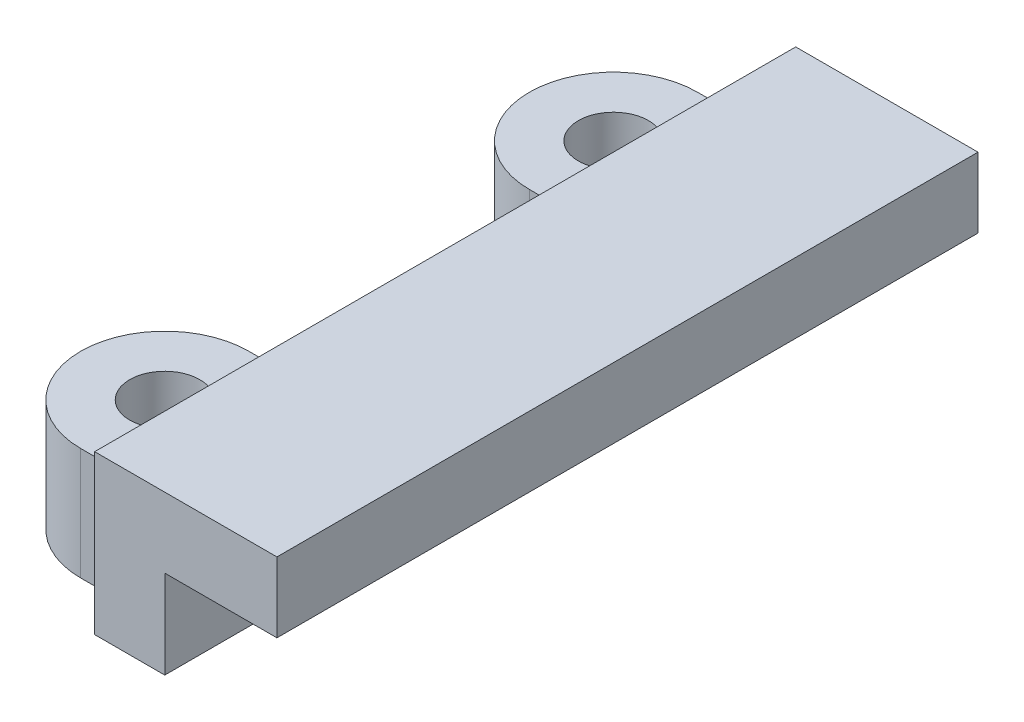
ISO-10303-21;
HEADER;
FILE_DESCRIPTION(('STEP AP214'),'2;1');
FILE_NAME('part.step','',(''),(''),'','','');
FILE_SCHEMA(('AUTOMOTIVE_DESIGN { 1 0 10303 214 1 1 1 1 }'));
ENDSEC;
DATA;
#1=APPLICATION_CONTEXT('core data for automotive mechanical design processes');
#2=APPLICATION_PROTOCOL_DEFINITION('international standard','automotive_design',2000,#1);
#3=PRODUCT_CONTEXT('',#1,'mechanical');
#4=PRODUCT('Part','Part','',(#3));
#5=PRODUCT_RELATED_PRODUCT_CATEGORY('part','',(#4));
#6=PRODUCT_DEFINITION_FORMATION('','',#4);
#7=PRODUCT_DEFINITION_CONTEXT('part definition',#1,'design');
#8=PRODUCT_DEFINITION('design','',#6,#7);
#9=PRODUCT_DEFINITION_SHAPE('','',#8);
#10=(LENGTH_UNIT() NAMED_UNIT(*) SI_UNIT(.MILLI.,.METRE.));
#11=(NAMED_UNIT(*) PLANE_ANGLE_UNIT() SI_UNIT($,.RADIAN.));
#12=(NAMED_UNIT(*) SI_UNIT($,.STERADIAN.) SOLID_ANGLE_UNIT());
#13=UNCERTAINTY_MEASURE_WITH_UNIT(LENGTH_MEASURE(1.E-05),#10,'distance_accuracy_value','');
#14=(GEOMETRIC_REPRESENTATION_CONTEXT(3) GLOBAL_UNCERTAINTY_ASSIGNED_CONTEXT((#13)) GLOBAL_UNIT_ASSIGNED_CONTEXT((#10,
#11,#12)) REPRESENTATION_CONTEXT('',''));
#15=CARTESIAN_POINT('',(0.,0.,0.));
#16=DIRECTION('',(0.,0.,1.));
#17=DIRECTION('',(1.,0.,0.));
#18=AXIS2_PLACEMENT_3D('',#15,#16,#17);
#19=CARTESIAN_POINT('',(161.,11.3,50.));
#20=DIRECTION('',(0.,0.,1.));
#21=DIRECTION('',(1.,0.,0.));
#22=AXIS2_PLACEMENT_3D('',#19,#20,#21);
#23=PLANE('',#22);
#24=DIRECTION('',(0.,1.,0.));
#25=VECTOR('',#24,1.);
#26=CARTESIAN_POINT('',(5.,0.,50.));
#27=LINE('',#26,#25);
#28=CARTESIAN_POINT('',(5.,0.,50.));
#29=VERTEX_POINT('',#28);
#30=CARTESIAN_POINT('',(5.,6.3,50.));
#31=VERTEX_POINT('',#30);
#32=EDGE_CURVE('E171',#29,#31,#27,.T.);
#33=ORIENTED_EDGE('',*,*,#32,.T.);
#34=DIRECTION('',(1.,0.,0.));
#35=VECTOR('',#34,1.);
#36=CARTESIAN_POINT('',(5.,6.3,50.));
#37=LINE('',#36,#35);
#38=CARTESIAN_POINT('',(13.,6.3,50.));
#39=VERTEX_POINT('',#38);
#40=EDGE_CURVE('E157',#31,#39,#37,.T.);
#41=ORIENTED_EDGE('',*,*,#40,.T.);
#42=DIRECTION('',(0.,1.,0.));
#43=VECTOR('',#42,1.);
#44=CARTESIAN_POINT('',(13.,11.3,50.));
#45=LINE('',#44,#43);
#46=CARTESIAN_POINT('',(13.,11.3,50.));
#47=VERTEX_POINT('',#46);
#48=EDGE_CURVE('E170',#39,#47,#45,.T.);
#49=ORIENTED_EDGE('',*,*,#48,.T.);
#50=DIRECTION('',(-1.,0.,0.));
#51=VECTOR('',#50,1.);
#52=CARTESIAN_POINT('',(161.,11.3,50.));
#53=LINE('',#52,#51);
#54=CARTESIAN_POINT('',(0.,11.3,50.));
#55=VERTEX_POINT('',#54);
#56=EDGE_CURVE('E268',#47,#55,#53,.T.);
#57=ORIENTED_EDGE('',*,*,#56,.T.);
#58=DIRECTION('',(0.,1.,0.));
#59=VECTOR('',#58,1.);
#60=CARTESIAN_POINT('',(0.,11.3,50.));
#61=LINE('',#60,#59);
#62=CARTESIAN_POINT('',(0.,0.,50.));
#63=VERTEX_POINT('',#62);
#64=EDGE_CURVE('E256',#63,#55,#61,.T.);
#65=ORIENTED_EDGE('',*,*,#64,.F.);
#66=DIRECTION('',(-1.,0.,0.));
#67=VECTOR('',#66,1.);
#68=CARTESIAN_POINT('',(161.,0.,50.));
#69=LINE('',#68,#67);
#70=EDGE_CURVE('E266',#29,#63,#69,.T.);
#71=ORIENTED_EDGE('',*,*,#70,.F.);
#72=EDGE_LOOP('',(#33,#41,#49,#57,#65,#71));
#73=FACE_BOUND('',#72,.T.);
#74=ADVANCED_FACE('F44',(#73),#23,.T.);
#75=CARTESIAN_POINT('',(13.,11.3,0.));
#76=DIRECTION('',(1.,0.,0.));
#77=DIRECTION('',(0.,0.,-1.));
#78=AXIS2_PLACEMENT_3D('',#75,#76,#77);
#79=PLANE('',#78);
#80=ORIENTED_EDGE('',*,*,#48,.F.);
#81=DIRECTION('',(0.,0.,1.));
#82=VECTOR('',#81,1.);
#83=CARTESIAN_POINT('',(13.,6.3,0.));
#84=LINE('',#83,#82);
#85=CARTESIAN_POINT('',(13.,6.3,0.));
#86=VERTEX_POINT('',#85);
#87=EDGE_CURVE('E151',#86,#39,#84,.T.);
#88=ORIENTED_EDGE('',*,*,#87,.F.);
#89=DIRECTION('',(0.,1.,0.));
#90=VECTOR('',#89,1.);
#91=CARTESIAN_POINT('',(13.,11.3,0.));
#92=LINE('',#91,#90);
#93=CARTESIAN_POINT('',(13.,11.3,0.));
#94=VERTEX_POINT('',#93);
#95=EDGE_CURVE('E276',#86,#94,#92,.T.);
#96=ORIENTED_EDGE('',*,*,#95,.T.);
#97=DIRECTION('',(0.,0.,1.));
#98=VECTOR('',#97,1.);
#99=CARTESIAN_POINT('',(13.,11.3,0.));
#100=LINE('',#99,#98);
#101=EDGE_CURVE('E161',#94,#47,#100,.T.);
#102=ORIENTED_EDGE('',*,*,#101,.T.);
#103=EDGE_LOOP('',(#80,#88,#96,#102));
#104=FACE_BOUND('',#103,.T.);
#105=ADVANCED_FACE('F172',(#104),#79,.T.);
#106=CARTESIAN_POINT('',(13.,6.3,0.));
#107=DIRECTION('',(0.,-1.,0.));
#108=DIRECTION('',(1.,0.,0.));
#109=AXIS2_PLACEMENT_3D('',#106,#107,#108);
#110=PLANE('',#109);
#111=ORIENTED_EDGE('',*,*,#87,.T.);
#112=ORIENTED_EDGE('',*,*,#40,.F.);
#113=DIRECTION('',(0.,0.,1.));
#114=VECTOR('',#113,1.);
#115=CARTESIAN_POINT('',(5.,6.3,0.));
#116=LINE('',#115,#114);
#117=CARTESIAN_POINT('',(5.,6.3,0.));
#118=VERTEX_POINT('',#117);
#119=EDGE_CURVE('E165',#118,#31,#116,.T.);
#120=ORIENTED_EDGE('',*,*,#119,.F.);
#121=DIRECTION('',(1.,0.,0.));
#122=VECTOR('',#121,1.);
#123=CARTESIAN_POINT('',(13.,6.3,0.));
#124=LINE('',#123,#122);
#125=EDGE_CURVE('E159',#118,#86,#124,.T.);
#126=ORIENTED_EDGE('',*,*,#125,.T.);
#127=EDGE_LOOP('',(#111,#112,#120,#126));
#128=FACE_BOUND('',#127,.T.);
#129=ADVANCED_FACE('F153',(#128),#110,.T.);
#130=CARTESIAN_POINT('',(0.,11.3,0.));
#131=DIRECTION('',(0.,1.,0.));
#132=DIRECTION('',(0.,0.,1.));
#133=AXIS2_PLACEMENT_3D('',#130,#131,#132);
#134=PLANE('',#133);
#135=ORIENTED_EDGE('',*,*,#56,.F.);
#136=ORIENTED_EDGE('',*,*,#101,.F.);
#137=DIRECTION('',(-1.,0.,0.));
#138=VECTOR('',#137,1.);
#139=CARTESIAN_POINT('',(0.,11.3,0.));
#140=LINE('',#139,#138);
#141=CARTESIAN_POINT('',(0.,11.3,0.));
#142=VERTEX_POINT('',#141);
#143=EDGE_CURVE('E285',#94,#142,#140,.T.);
#144=ORIENTED_EDGE('',*,*,#143,.T.);
#145=DIRECTION('',(0.,0.,1.));
#146=VECTOR('',#145,1.);
#147=CARTESIAN_POINT('',(0.,11.3,0.));
#148=LINE('',#147,#146);
#149=EDGE_CURVE('E287',#142,#55,#148,.T.);
#150=ORIENTED_EDGE('',*,*,#149,.T.);
#151=EDGE_LOOP('',(#135,#136,#144,#150));
#152=FACE_BOUND('',#151,.T.);
#153=ADVANCED_FACE('F346',(#152),#134,.T.);
#154=CARTESIAN_POINT('',(5.,0.,0.));
#155=DIRECTION('',(0.,-1.,0.));
#156=DIRECTION('',(1.,0.,0.));
#157=AXIS2_PLACEMENT_3D('',#154,#155,#156);
#158=PLANE('',#157);
#159=DIRECTION('',(0.,0.,1.));
#160=VECTOR('',#159,1.);
#161=CARTESIAN_POINT('',(5.,0.,0.));
#162=LINE('',#161,#160);
#163=CARTESIAN_POINT('',(5.,0.,0.));
#164=VERTEX_POINT('',#163);
#165=EDGE_CURVE('E11',#164,#29,#162,.T.);
#166=ORIENTED_EDGE('',*,*,#165,.T.);
#167=ORIENTED_EDGE('',*,*,#70,.T.);
#168=DIRECTION('',(0.,0.,1.));
#169=VECTOR('',#168,1.);
#170=CARTESIAN_POINT('',(0.,0.,0.));
#171=LINE('',#170,#169);
#172=CARTESIAN_POINT('',(0.,0.,47.));
#173=VERTEX_POINT('',#172);
#174=EDGE_CURVE('E295',#173,#63,#171,.T.);
#175=ORIENTED_EDGE('',*,*,#174,.F.);
#176=DIRECTION('',(1.,0.,0.));
#177=VECTOR('',#176,1.);
#178=CARTESIAN_POINT('',(0.,0.,47.));
#179=LINE('',#178,#177);
#180=CARTESIAN_POINT('',(-4.,0.,47.));
#181=VERTEX_POINT('',#180);
#182=EDGE_CURVE('E72',#181,#173,#179,.T.);
#183=ORIENTED_EDGE('',*,*,#182,.F.);
#184=CARTESIAN_POINT('',(-4.,0.,41.));
#185=DIRECTION('',(0.,1.,0.));
#186=DIRECTION('',(-1.,0.,0.));
#187=AXIS2_PLACEMENT_3D('',#184,#185,#186);
#188=CIRCLE('',#187,6.);
#189=CARTESIAN_POINT('',(-4.,0.,35.));
#190=VERTEX_POINT('',#189);
#191=EDGE_CURVE('E250',#190,#181,#188,.T.);
#192=ORIENTED_EDGE('',*,*,#191,.F.);
#193=DIRECTION('',(-1.,0.,0.));
#194=VECTOR('',#193,1.);
#195=CARTESIAN_POINT('',(0.,0.,35.));
#196=LINE('',#195,#194);
#197=CARTESIAN_POINT('',(0.,0.,35.));
#198=VERTEX_POINT('',#197);
#199=EDGE_CURVE('E232',#198,#190,#196,.T.);
#200=ORIENTED_EDGE('',*,*,#199,.F.);
#201=CARTESIAN_POINT('',(0.,0.,15.0000000000002));
#202=VERTEX_POINT('',#201);
#203=EDGE_CURVE('E305',#202,#198,#171,.T.);
#204=ORIENTED_EDGE('',*,*,#203,.F.);
#205=DIRECTION('',(-1.,0.,0.));
#206=VECTOR('',#205,1.);
#207=CARTESIAN_POINT('',(0.,0.,15.0000000000002));
#208=LINE('',#207,#206);
#209=CARTESIAN_POINT('',(-3.99999999999998,0.,15.0000000000002));
#210=VERTEX_POINT('',#209);
#211=EDGE_CURVE('E205',#202,#210,#208,.T.);
#212=ORIENTED_EDGE('',*,*,#211,.T.);
#213=CARTESIAN_POINT('',(-3.99999999999998,0.,9.00000000000017));
#214=DIRECTION('',(0.,-1.,0.));
#215=DIRECTION('',(-1.,0.,0.));
#216=AXIS2_PLACEMENT_3D('',#213,#214,#215);
#217=CIRCLE('',#216,6.);
#218=CARTESIAN_POINT('',(-3.99999999999995,0.,3.00000000000017));
#219=VERTEX_POINT('',#218);
#220=EDGE_CURVE('E207',#210,#219,#217,.T.);
#221=ORIENTED_EDGE('',*,*,#220,.T.);
#222=DIRECTION('',(1.,0.,0.));
#223=VECTOR('',#222,1.);
#224=CARTESIAN_POINT('',(0.,0.,3.00000000000018));
#225=LINE('',#224,#223);
#226=CARTESIAN_POINT('',(0.,0.,3.00000000000018));
#227=VERTEX_POINT('',#226);
#228=EDGE_CURVE('E188',#219,#227,#225,.T.);
#229=ORIENTED_EDGE('',*,*,#228,.T.);
#230=CARTESIAN_POINT('',(0.,0.,0.));
#231=VERTEX_POINT('',#230);
#232=EDGE_CURVE('E54',#231,#227,#171,.T.);
#233=ORIENTED_EDGE('',*,*,#232,.F.);
#234=DIRECTION('',(1.,0.,0.));
#235=VECTOR('',#234,1.);
#236=CARTESIAN_POINT('',(5.,0.,0.));
#237=LINE('',#236,#235);
#238=EDGE_CURVE('E296',#231,#164,#237,.T.);
#239=ORIENTED_EDGE('',*,*,#238,.T.);
#240=EDGE_LOOP('',(#166,#167,#175,#183,#192,#200,#204,#212,#221,#229,#233,#239));
#241=FACE_BOUND('',#240,.T.);
#242=CARTESIAN_POINT('',(-4.,0.,41.));
#243=DIRECTION('',(0.,1.,0.));
#244=DIRECTION('',(-1.,0.,0.));
#245=AXIS2_PLACEMENT_3D('',#242,#243,#244);
#246=CIRCLE('',#245,2.5);
#247=CARTESIAN_POINT('',(-6.5,0.,41.));
#248=VERTEX_POINT('',#247);
#249=EDGE_CURVE('E219',#248,#248,#246,.T.);
#250=ORIENTED_EDGE('',*,*,#249,.T.);
#251=EDGE_LOOP('',(#250));
#252=FACE_BOUND('',#251,.T.);
#253=CARTESIAN_POINT('',(-3.99999999999998,0.,9.00000000000017));
#254=DIRECTION('',(0.,-1.,0.));
#255=DIRECTION('',(-1.,0.,0.));
#256=AXIS2_PLACEMENT_3D('',#253,#254,#255);
#257=CIRCLE('',#256,2.5);
#258=CARTESIAN_POINT('',(-6.49999999999997,0.,9.00000000000016));
#259=VERTEX_POINT('',#258);
#260=EDGE_CURVE('E178',#259,#259,#257,.T.);
#261=ORIENTED_EDGE('',*,*,#260,.F.);
#262=EDGE_LOOP('',(#261));
#263=FACE_BOUND('',#262,.T.);
#264=ADVANCED_FACE('F339',(#241,#252,#263),#158,.T.);
#265=CARTESIAN_POINT('',(0.,0.,0.));
#266=DIRECTION('',(0.,0.,-1.));
#267=DIRECTION('',(-1.,0.,0.));
#268=AXIS2_PLACEMENT_3D('',#265,#266,#267);
#269=PLANE('',#268);
#270=ORIENTED_EDGE('',*,*,#238,.F.);
#271=DIRECTION('',(0.,-1.,0.));
#272=VECTOR('',#271,1.);
#273=CARTESIAN_POINT('',(0.,0.,0.));
#274=LINE('',#273,#272);
#275=EDGE_CURVE('E288',#142,#231,#274,.T.);
#276=ORIENTED_EDGE('',*,*,#275,.F.);
#277=ORIENTED_EDGE('',*,*,#143,.F.);
#278=ORIENTED_EDGE('',*,*,#95,.F.);
#279=ORIENTED_EDGE('',*,*,#125,.F.);
#280=DIRECTION('',(0.,1.,0.));
#281=VECTOR('',#280,1.);
#282=CARTESIAN_POINT('',(5.,6.3,0.));
#283=LINE('',#282,#281);
#284=EDGE_CURVE('E279',#164,#118,#283,.T.);
#285=ORIENTED_EDGE('',*,*,#284,.F.);
#286=EDGE_LOOP('',(#270,#276,#277,#278,#279,#285));
#287=FACE_BOUND('',#286,.T.);
#288=ADVANCED_FACE('F50',(#287),#269,.T.);
#289=CARTESIAN_POINT('',(0.,0.,0.));
#290=DIRECTION('',(-1.,0.,0.));
#291=DIRECTION('',(0.,0.,1.));
#292=AXIS2_PLACEMENT_3D('',#289,#290,#291);
#293=PLANE('',#292);
#294=DIRECTION('',(0.,-1.,0.));
#295=VECTOR('',#294,1.);
#296=CARTESIAN_POINT('',(0.,8.,3.00000000000018));
#297=LINE('',#296,#295);
#298=CARTESIAN_POINT('',(0.,8.,3.00000000000018));
#299=VERTEX_POINT('',#298);
#300=EDGE_CURVE('E212',#299,#227,#297,.T.);
#301=ORIENTED_EDGE('',*,*,#300,.F.);
#302=DIRECTION('',(0.,0.,1.));
#303=VECTOR('',#302,1.);
#304=CARTESIAN_POINT('',(0.,8.,3.00000000000018));
#305=LINE('',#304,#303);
#306=CARTESIAN_POINT('',(0.,8.,15.0000000000002));
#307=VERTEX_POINT('',#306);
#308=EDGE_CURVE('E187',#299,#307,#305,.T.);
#309=ORIENTED_EDGE('',*,*,#308,.T.);
#310=DIRECTION('',(0.,-1.,0.));
#311=VECTOR('',#310,1.);
#312=CARTESIAN_POINT('',(0.,8.,15.0000000000002));
#313=LINE('',#312,#311);
#314=EDGE_CURVE('E202',#307,#202,#313,.T.);
#315=ORIENTED_EDGE('',*,*,#314,.T.);
#316=ORIENTED_EDGE('',*,*,#203,.T.);
#317=DIRECTION('',(0.,-1.,0.));
#318=VECTOR('',#317,1.);
#319=CARTESIAN_POINT('',(0.,8.,35.));
#320=LINE('',#319,#318);
#321=CARTESIAN_POINT('',(0.,8.,35.));
#322=VERTEX_POINT('',#321);
#323=EDGE_CURVE('E255',#322,#198,#320,.T.);
#324=ORIENTED_EDGE('',*,*,#323,.F.);
#325=DIRECTION('',(0.,0.,-1.));
#326=VECTOR('',#325,1.);
#327=CARTESIAN_POINT('',(0.,8.,47.));
#328=LINE('',#327,#326);
#329=CARTESIAN_POINT('',(0.,8.,47.));
#330=VERTEX_POINT('',#329);
#331=EDGE_CURVE('E229',#330,#322,#328,.T.);
#332=ORIENTED_EDGE('',*,*,#331,.F.);
#333=DIRECTION('',(0.,-1.,0.));
#334=VECTOR('',#333,1.);
#335=CARTESIAN_POINT('',(0.,8.,47.));
#336=LINE('',#335,#334);
#337=EDGE_CURVE('E242',#330,#173,#336,.T.);
#338=ORIENTED_EDGE('',*,*,#337,.T.);
#339=ORIENTED_EDGE('',*,*,#174,.T.);
#340=ORIENTED_EDGE('',*,*,#64,.T.);
#341=ORIENTED_EDGE('',*,*,#149,.F.);
#342=ORIENTED_EDGE('',*,*,#275,.T.);
#343=ORIENTED_EDGE('',*,*,#232,.T.);
#344=EDGE_LOOP('',(#301,#309,#315,#316,#324,#332,#338,#339,#340,#341,#342,#343));
#345=FACE_BOUND('',#344,.T.);
#346=ADVANCED_FACE('F324',(#345),#293,.T.);
#347=CARTESIAN_POINT('',(5.,6.3,0.));
#348=DIRECTION('',(1.,0.,0.));
#349=DIRECTION('',(0.,1.,0.));
#350=AXIS2_PLACEMENT_3D('',#347,#348,#349);
#351=PLANE('',#350);
#352=ORIENTED_EDGE('',*,*,#119,.T.);
#353=ORIENTED_EDGE('',*,*,#32,.F.);
#354=ORIENTED_EDGE('',*,*,#165,.F.);
#355=ORIENTED_EDGE('',*,*,#284,.T.);
#356=EDGE_LOOP('',(#352,#353,#354,#355));
#357=FACE_BOUND('',#356,.T.);
#358=ADVANCED_FACE('F347',(#357),#351,.T.);
#359=CARTESIAN_POINT('',(0.,8.,35.));
#360=DIRECTION('',(0.,0.,1.));
#361=DIRECTION('',(1.,0.,0.));
#362=AXIS2_PLACEMENT_3D('',#359,#360,#361);
#363=PLANE('',#362);
#364=ORIENTED_EDGE('',*,*,#199,.T.);
#365=DIRECTION('',(0.,-1.,0.));
#366=VECTOR('',#365,1.);
#367=CARTESIAN_POINT('',(-4.,8.,35.));
#368=LINE('',#367,#366);
#369=CARTESIAN_POINT('',(-4.,8.,35.));
#370=VERTEX_POINT('',#369);
#371=EDGE_CURVE('E260',#370,#190,#368,.T.);
#372=ORIENTED_EDGE('',*,*,#371,.F.);
#373=DIRECTION('',(-1.,0.,0.));
#374=VECTOR('',#373,1.);
#375=CARTESIAN_POINT('',(0.,8.,35.));
#376=LINE('',#375,#374);
#377=EDGE_CURVE('E241',#322,#370,#376,.T.);
#378=ORIENTED_EDGE('',*,*,#377,.F.);
#379=ORIENTED_EDGE('',*,*,#323,.T.);
#380=EDGE_LOOP('',(#364,#372,#378,#379));
#381=FACE_BOUND('',#380,.T.);
#382=ADVANCED_FACE('F328',(#381),#363,.F.);
#383=CARTESIAN_POINT('',(-4.,8.,41.));
#384=DIRECTION('',(0.,-1.,0.));
#385=DIRECTION('',(1.,0.,0.));
#386=AXIS2_PLACEMENT_3D('',#383,#384,#385);
#387=CYLINDRICAL_SURFACE('',#386,6.);
#388=ORIENTED_EDGE('',*,*,#191,.T.);
#389=DIRECTION('',(0.,-1.,0.));
#390=VECTOR('',#389,1.);
#391=CARTESIAN_POINT('',(-4.,8.,47.));
#392=LINE('',#391,#390);
#393=CARTESIAN_POINT('',(-4.,8.,47.));
#394=VERTEX_POINT('',#393);
#395=EDGE_CURVE('E264',#394,#181,#392,.T.);
#396=ORIENTED_EDGE('',*,*,#395,.F.);
#397=CARTESIAN_POINT('',(-4.,8.,41.));
#398=DIRECTION('',(0.,1.,0.));
#399=DIRECTION('',(-1.,0.,0.));
#400=AXIS2_PLACEMENT_3D('',#397,#398,#399);
#401=CIRCLE('',#400,6.);
#402=EDGE_CURVE('E238',#370,#394,#401,.T.);
#403=ORIENTED_EDGE('',*,*,#402,.F.);
#404=ORIENTED_EDGE('',*,*,#371,.T.);
#405=EDGE_LOOP('',(#388,#396,#403,#404));
#406=FACE_BOUND('',#405,.T.);
#407=ADVANCED_FACE('F331',(#406),#387,.T.);
#408=CARTESIAN_POINT('',(0.,8.,47.));
#409=DIRECTION('',(0.,0.,-1.));
#410=DIRECTION('',(-1.,0.,0.));
#411=AXIS2_PLACEMENT_3D('',#408,#409,#410);
#412=PLANE('',#411);
#413=ORIENTED_EDGE('',*,*,#182,.T.);
#414=ORIENTED_EDGE('',*,*,#337,.F.);
#415=DIRECTION('',(1.,0.,0.));
#416=VECTOR('',#415,1.);
#417=CARTESIAN_POINT('',(0.,8.,47.));
#418=LINE('',#417,#416);
#419=EDGE_CURVE('E234',#394,#330,#418,.T.);
#420=ORIENTED_EDGE('',*,*,#419,.F.);
#421=ORIENTED_EDGE('',*,*,#395,.T.);
#422=EDGE_LOOP('',(#413,#414,#420,#421));
#423=FACE_BOUND('',#422,.T.);
#424=ADVANCED_FACE('F320',(#423),#412,.F.);
#425=CARTESIAN_POINT('',(-4.,8.,41.));
#426=DIRECTION('',(0.,-1.,0.));
#427=DIRECTION('',(-1.,0.,0.));
#428=AXIS2_PLACEMENT_3D('',#425,#426,#427);
#429=PLANE('',#428);
#430=CARTESIAN_POINT('',(-4.,8.,41.));
#431=DIRECTION('',(0.,-1.,0.));
#432=DIRECTION('',(1.,0.,0.));
#433=AXIS2_PLACEMENT_3D('',#430,#431,#432);
#434=CIRCLE('',#433,2.5);
#435=CARTESIAN_POINT('',(-1.50000000000001,8.,41.));
#436=VERTEX_POINT('',#435);
#437=EDGE_CURVE('E230',#436,#436,#434,.F.);
#438=ORIENTED_EDGE('',*,*,#437,.F.);
#439=EDGE_LOOP('',(#438));
#440=FACE_BOUND('',#439,.T.);
#441=ORIENTED_EDGE('',*,*,#331,.T.);
#442=ORIENTED_EDGE('',*,*,#377,.T.);
#443=ORIENTED_EDGE('',*,*,#402,.T.);
#444=ORIENTED_EDGE('',*,*,#419,.T.);
#445=EDGE_LOOP('',(#441,#442,#443,#444));
#446=FACE_BOUND('',#445,.T.);
#447=ADVANCED_FACE('F313',(#440,#446),#429,.F.);
#448=CARTESIAN_POINT('',(-4.,11.3,41.));
#449=DIRECTION('',(0.,-1.,0.));
#450=DIRECTION('',(1.,0.,0.));
#451=AXIS2_PLACEMENT_3D('',#448,#449,#450);
#452=CYLINDRICAL_SURFACE('',#451,2.5);
#453=ORIENTED_EDGE('',*,*,#249,.F.);
#454=EDGE_LOOP('',(#453));
#455=FACE_BOUND('',#454,.T.);
#456=ORIENTED_EDGE('',*,*,#437,.T.);
#457=EDGE_LOOP('',(#456));
#458=FACE_BOUND('',#457,.T.);
#459=ADVANCED_FACE('F315',(#455,#458),#452,.F.);
#460=CARTESIAN_POINT('',(0.,8.,3.00000000000018));
#461=DIRECTION('',(0.,0.,-1.));
#462=DIRECTION('',(-1.,0.,0.));
#463=AXIS2_PLACEMENT_3D('',#460,#461,#462);
#464=PLANE('',#463);
#465=ORIENTED_EDGE('',*,*,#228,.F.);
#466=DIRECTION('',(0.,-1.,0.));
#467=VECTOR('',#466,1.);
#468=CARTESIAN_POINT('',(-3.99999999999995,8.,3.00000000000017));
#469=LINE('',#468,#467);
#470=CARTESIAN_POINT('',(-3.99999999999995,8.,3.00000000000017));
#471=VERTEX_POINT('',#470);
#472=EDGE_CURVE('E216',#471,#219,#469,.T.);
#473=ORIENTED_EDGE('',*,*,#472,.F.);
#474=DIRECTION('',(1.,0.,0.));
#475=VECTOR('',#474,1.);
#476=CARTESIAN_POINT('',(0.,8.,3.00000000000018));
#477=LINE('',#476,#475);
#478=EDGE_CURVE('E196',#471,#299,#477,.T.);
#479=ORIENTED_EDGE('',*,*,#478,.T.);
#480=ORIENTED_EDGE('',*,*,#300,.T.);
#481=EDGE_LOOP('',(#465,#473,#479,#480));
#482=FACE_BOUND('',#481,.T.);
#483=ADVANCED_FACE('F414',(#482),#464,.T.);
#484=CARTESIAN_POINT('',(-3.99999999999998,8.,9.00000000000017));
#485=DIRECTION('',(0.,-1.,0.));
#486=DIRECTION('',(1.,0.,0.));
#487=AXIS2_PLACEMENT_3D('',#484,#485,#486);
#488=CYLINDRICAL_SURFACE('',#487,6.);
#489=ORIENTED_EDGE('',*,*,#220,.F.);
#490=DIRECTION('',(0.,-1.,0.));
#491=VECTOR('',#490,1.);
#492=CARTESIAN_POINT('',(-3.99999999999998,8.,15.0000000000002));
#493=LINE('',#492,#491);
#494=CARTESIAN_POINT('',(-3.99999999999998,8.,15.0000000000002));
#495=VERTEX_POINT('',#494);
#496=EDGE_CURVE('E217',#495,#210,#493,.T.);
#497=ORIENTED_EDGE('',*,*,#496,.F.);
#498=CARTESIAN_POINT('',(-3.99999999999998,8.,9.00000000000017));
#499=DIRECTION('',(0.,-1.,0.));
#500=DIRECTION('',(-1.,0.,0.));
#501=AXIS2_PLACEMENT_3D('',#498,#499,#500);
#502=CIRCLE('',#501,6.);
#503=EDGE_CURVE('E192',#495,#471,#502,.T.);
#504=ORIENTED_EDGE('',*,*,#503,.T.);
#505=ORIENTED_EDGE('',*,*,#472,.T.);
#506=EDGE_LOOP('',(#489,#497,#504,#505));
#507=FACE_BOUND('',#506,.T.);
#508=ADVANCED_FACE('F405',(#507),#488,.T.);
#509=CARTESIAN_POINT('',(0.,8.,15.0000000000002));
#510=DIRECTION('',(0.,0.,1.));
#511=DIRECTION('',(1.,0.,0.));
#512=AXIS2_PLACEMENT_3D('',#509,#510,#511);
#513=PLANE('',#512);
#514=ORIENTED_EDGE('',*,*,#211,.F.);
#515=ORIENTED_EDGE('',*,*,#314,.F.);
#516=DIRECTION('',(-1.,0.,0.));
#517=VECTOR('',#516,1.);
#518=CARTESIAN_POINT('',(0.,8.,15.0000000000002));
#519=LINE('',#518,#517);
#520=EDGE_CURVE('E62',#307,#495,#519,.T.);
#521=ORIENTED_EDGE('',*,*,#520,.T.);
#522=ORIENTED_EDGE('',*,*,#496,.T.);
#523=EDGE_LOOP('',(#514,#515,#521,#522));
#524=FACE_BOUND('',#523,.T.);
#525=ADVANCED_FACE('F395',(#524),#513,.T.);
#526=CARTESIAN_POINT('',(-3.99999999999998,8.,9.00000000000017));
#527=DIRECTION('',(0.,-1.,0.));
#528=DIRECTION('',(-1.,0.,0.));
#529=AXIS2_PLACEMENT_3D('',#526,#527,#528);
#530=PLANE('',#529);
#531=CARTESIAN_POINT('',(-3.99999999999998,8.,9.00000000000017));
#532=DIRECTION('',(0.,-1.,0.));
#533=DIRECTION('',(1.,0.,0.));
#534=AXIS2_PLACEMENT_3D('',#531,#532,#533);
#535=CIRCLE('',#534,2.5);
#536=CARTESIAN_POINT('',(-1.49999999999998,8.,9.00000000000017));
#537=VERTEX_POINT('',#536);
#538=EDGE_CURVE('E47',#537,#537,#535,.T.);
#539=ORIENTED_EDGE('',*,*,#538,.T.);
#540=EDGE_LOOP('',(#539));
#541=FACE_BOUND('',#540,.T.);
#542=ORIENTED_EDGE('',*,*,#308,.F.);
#543=ORIENTED_EDGE('',*,*,#478,.F.);
#544=ORIENTED_EDGE('',*,*,#503,.F.);
#545=ORIENTED_EDGE('',*,*,#520,.F.);
#546=EDGE_LOOP('',(#542,#543,#544,#545));
#547=FACE_BOUND('',#546,.T.);
#548=ADVANCED_FACE('F384',(#541,#547),#530,.F.);
#549=CARTESIAN_POINT('',(-3.99999999999998,11.3,9.00000000000017));
#550=DIRECTION('',(0.,-1.,0.));
#551=DIRECTION('',(1.,0.,0.));
#552=AXIS2_PLACEMENT_3D('',#549,#550,#551);
#553=CYLINDRICAL_SURFACE('',#552,2.5);
#554=ORIENTED_EDGE('',*,*,#260,.T.);
#555=EDGE_LOOP('',(#554));
#556=FACE_BOUND('',#555,.T.);
#557=ORIENTED_EDGE('',*,*,#538,.F.);
#558=EDGE_LOOP('',(#557));
#559=FACE_BOUND('',#558,.T.);
#560=ADVANCED_FACE('F378',(#556,#559),#553,.F.);
#561=CLOSED_SHELL('',(#74,#105,#129,#153,#264,#288,#346,#358,#382,#407,#424,#447,#459,#483,#508,
#525,#548,#560));
#562=MANIFOLD_SOLID_BREP('B2',#561);
#563=ADVANCED_BREP_SHAPE_REPRESENTATION('',(#18,#562),#14);
#564=SHAPE_DEFINITION_REPRESENTATION(#9,#563);
ENDSEC;
END-ISO-10303-21;
